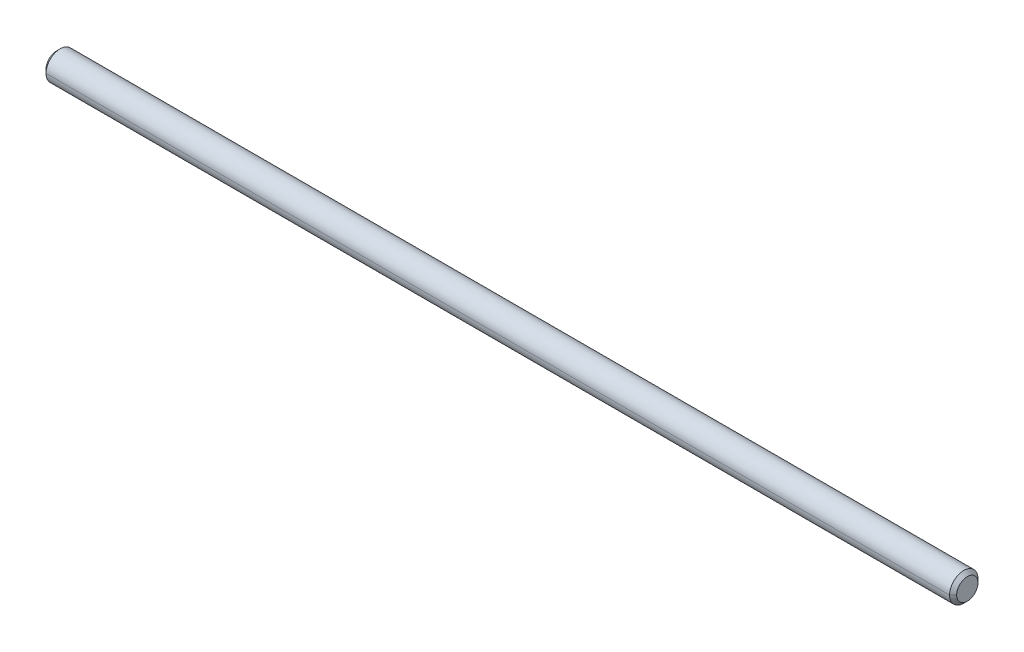
ISO-10303-21;
HEADER;
FILE_DESCRIPTION(('STEP AP214'),'2;1');
FILE_NAME('part.step','',(''),(''),'','','');
FILE_SCHEMA(('AUTOMOTIVE_DESIGN { 1 0 10303 214 1 1 1 1 }'));
ENDSEC;
DATA;
#1=APPLICATION_CONTEXT('core data for automotive mechanical design processes');
#2=APPLICATION_PROTOCOL_DEFINITION('international standard','automotive_design',2000,#1);
#3=PRODUCT_CONTEXT('',#1,'mechanical');
#4=PRODUCT('Part','Part','',(#3));
#5=PRODUCT_RELATED_PRODUCT_CATEGORY('part','',(#4));
#6=PRODUCT_DEFINITION_FORMATION('','',#4);
#7=PRODUCT_DEFINITION_CONTEXT('part definition',#1,'design');
#8=PRODUCT_DEFINITION('design','',#6,#7);
#9=PRODUCT_DEFINITION_SHAPE('','',#8);
#10=(LENGTH_UNIT() NAMED_UNIT(*) SI_UNIT(.MILLI.,.METRE.));
#11=(NAMED_UNIT(*) PLANE_ANGLE_UNIT() SI_UNIT($,.RADIAN.));
#12=(NAMED_UNIT(*) SI_UNIT($,.STERADIAN.) SOLID_ANGLE_UNIT());
#13=UNCERTAINTY_MEASURE_WITH_UNIT(LENGTH_MEASURE(1.E-05),#10,'distance_accuracy_value','');
#14=(GEOMETRIC_REPRESENTATION_CONTEXT(3) GLOBAL_UNCERTAINTY_ASSIGNED_CONTEXT((#13)) GLOBAL_UNIT_ASSIGNED_CONTEXT((#10,
#11,#12)) REPRESENTATION_CONTEXT('',''));
#15=CARTESIAN_POINT('',(0.,0.,0.));
#16=DIRECTION('',(0.,0.,1.));
#17=DIRECTION('',(1.,0.,0.));
#18=AXIS2_PLACEMENT_3D('',#15,#16,#17);
#19=CARTESIAN_POINT('',(152.4,0.,0.));
#20=DIRECTION('',(-1.,0.,0.));
#21=DIRECTION('',(0.,0.,1.));
#22=AXIS2_PLACEMENT_3D('',#19,#20,#21);
#23=CONICAL_SURFACE('',#22,3.571875,0.785398163397471);
#24=DIRECTION('',(-0.707106781186532,0.,-0.707106781186564));
#25=VECTOR('',#24,1.);
#26=CARTESIAN_POINT('',(152.4,0.,-3.571875));
#27=LINE('',#26,#25);
#28=CARTESIAN_POINT('',(152.4,0.,-3.571875));
#29=VERTEX_POINT('',#28);
#30=CARTESIAN_POINT('',(151.209375,0.,-4.7625));
#31=VERTEX_POINT('',#30);
#32=EDGE_CURVE('E77',#29,#31,#27,.T.);
#33=ORIENTED_EDGE('',*,*,#32,.F.);
#34=CARTESIAN_POINT('',(152.4,0.,0.));
#35=DIRECTION('',(1.,0.,0.));
#36=DIRECTION('',(0.,0.,-1.));
#37=AXIS2_PLACEMENT_3D('',#34,#35,#36);
#38=CIRCLE('',#37,3.571875);
#39=CARTESIAN_POINT('',(152.4,0.,3.571875));
#40=VERTEX_POINT('',#39);
#41=EDGE_CURVE('E11',#40,#29,#38,.T.);
#42=ORIENTED_EDGE('',*,*,#41,.F.);
#43=DIRECTION('',(-0.707106781186532,0.,0.707106781186564));
#44=VECTOR('',#43,1.);
#45=CARTESIAN_POINT('',(152.4,0.,3.571875));
#46=LINE('',#45,#44);
#47=CARTESIAN_POINT('',(151.209375,0.,4.7625));
#48=VERTEX_POINT('',#47);
#49=EDGE_CURVE('E74',#40,#48,#46,.T.);
#50=ORIENTED_EDGE('',*,*,#49,.T.);
#51=CARTESIAN_POINT('',(151.209375,0.,0.));
#52=DIRECTION('',(-1.,0.,0.));
#53=DIRECTION('',(0.,0.,-1.));
#54=AXIS2_PLACEMENT_3D('',#51,#52,#53);
#55=CIRCLE('',#54,4.7625);
#56=EDGE_CURVE('E117',#31,#48,#55,.T.);
#57=ORIENTED_EDGE('',*,*,#56,.F.);
#58=EDGE_LOOP('',(#33,#42,#50,#57));
#59=FACE_BOUND('',#58,.T.);
#60=ADVANCED_FACE('F17',(#59),#23,.T.);
#61=CARTESIAN_POINT('',(-151.209375,0.,0.));
#62=DIRECTION('',(1.,0.,0.));
#63=DIRECTION('',(0.,0.,-1.));
#64=AXIS2_PLACEMENT_3D('',#61,#62,#63);
#65=CONICAL_SURFACE('',#64,4.7625,0.785398163397459);
#66=DIRECTION('',(0.70710678118654,0.,0.707106781186555));
#67=VECTOR('',#66,1.);
#68=CARTESIAN_POINT('',(-151.209375,0.,4.7625));
#69=LINE('',#68,#67);
#70=CARTESIAN_POINT('',(-152.4,0.,3.57187499999984));
#71=VERTEX_POINT('',#70);
#72=CARTESIAN_POINT('',(-151.209375,0.,4.7625));
#73=VERTEX_POINT('',#72);
#74=EDGE_CURVE('E108',#71,#73,#69,.T.);
#75=ORIENTED_EDGE('',*,*,#74,.F.);
#76=CARTESIAN_POINT('',(-152.4,0.,0.));
#77=DIRECTION('',(-1.,0.,0.));
#78=DIRECTION('',(0.,0.,-1.));
#79=AXIS2_PLACEMENT_3D('',#76,#77,#78);
#80=CIRCLE('',#79,3.57187499999984);
#81=CARTESIAN_POINT('',(-152.4,0.,-3.57187499999984));
#82=VERTEX_POINT('',#81);
#83=EDGE_CURVE('E25',#82,#71,#80,.T.);
#84=ORIENTED_EDGE('',*,*,#83,.F.);
#85=DIRECTION('',(0.70710678118654,0.,-0.707106781186555));
#86=VECTOR('',#85,1.);
#87=CARTESIAN_POINT('',(-151.209375,0.,-4.7625));
#88=LINE('',#87,#86);
#89=CARTESIAN_POINT('',(-151.209375,0.,-4.7625));
#90=VERTEX_POINT('',#89);
#91=EDGE_CURVE('E105',#82,#90,#88,.T.);
#92=ORIENTED_EDGE('',*,*,#91,.T.);
#93=CARTESIAN_POINT('',(-151.209375,0.,0.));
#94=DIRECTION('',(1.,0.,0.));
#95=DIRECTION('',(0.,0.,-1.));
#96=AXIS2_PLACEMENT_3D('',#93,#94,#95);
#97=CIRCLE('',#96,4.7625);
#98=EDGE_CURVE('E36',#73,#90,#97,.T.);
#99=ORIENTED_EDGE('',*,*,#98,.F.);
#100=EDGE_LOOP('',(#75,#84,#92,#99));
#101=FACE_BOUND('',#100,.T.);
#102=ADVANCED_FACE('F135',(#101),#65,.T.);
#103=CARTESIAN_POINT('',(152.4,0.,0.));
#104=DIRECTION('',(1.,0.,0.));
#105=DIRECTION('',(0.,1.,0.));
#106=AXIS2_PLACEMENT_3D('',#103,#104,#105);
#107=PLANE('',#106);
#108=ORIENTED_EDGE('',*,*,#41,.T.);
#109=CARTESIAN_POINT('',(152.4,0.,0.));
#110=DIRECTION('',(1.,0.,0.));
#111=DIRECTION('',(0.,0.,-1.));
#112=AXIS2_PLACEMENT_3D('',#109,#110,#111);
#113=CIRCLE('',#112,3.571875);
#114=EDGE_CURVE('E81',#29,#40,#113,.T.);
#115=ORIENTED_EDGE('',*,*,#114,.T.);
#116=EDGE_LOOP('',(#108,#115));
#117=FACE_BOUND('',#116,.T.);
#118=ADVANCED_FACE('F89',(#117),#107,.T.);
#119=CARTESIAN_POINT('',(-152.4,0.,0.));
#120=DIRECTION('',(1.,0.,0.));
#121=DIRECTION('',(0.,1.,0.));
#122=AXIS2_PLACEMENT_3D('',#119,#120,#121);
#123=PLANE('',#122);
#124=ORIENTED_EDGE('',*,*,#83,.T.);
#125=CARTESIAN_POINT('',(-152.4,0.,0.));
#126=DIRECTION('',(-1.,0.,0.));
#127=DIRECTION('',(0.,0.,-1.));
#128=AXIS2_PLACEMENT_3D('',#125,#126,#127);
#129=CIRCLE('',#128,3.57187499999984);
#130=EDGE_CURVE('E86',#71,#82,#129,.T.);
#131=ORIENTED_EDGE('',*,*,#130,.T.);
#132=EDGE_LOOP('',(#124,#131));
#133=FACE_BOUND('',#132,.T.);
#134=ADVANCED_FACE('F127',(#133),#123,.F.);
#135=CARTESIAN_POINT('',(-152.4,0.,0.));
#136=DIRECTION('',(1.,0.,0.));
#137=DIRECTION('',(0.,0.,-1.));
#138=AXIS2_PLACEMENT_3D('',#135,#136,#137);
#139=CYLINDRICAL_SURFACE('',#138,4.7625);
#140=DIRECTION('',(1.,0.,0.));
#141=VECTOR('',#140,1.);
#142=CARTESIAN_POINT('',(-152.4,0.,4.7625));
#143=LINE('',#142,#141);
#144=EDGE_CURVE('E97',#73,#48,#143,.T.);
#145=ORIENTED_EDGE('',*,*,#144,.F.);
#146=ORIENTED_EDGE('',*,*,#98,.T.);
#147=DIRECTION('',(1.,0.,0.));
#148=VECTOR('',#147,1.);
#149=CARTESIAN_POINT('',(-152.4,0.,-4.7625));
#150=LINE('',#149,#148);
#151=EDGE_CURVE('E101',#90,#31,#150,.T.);
#152=ORIENTED_EDGE('',*,*,#151,.T.);
#153=ORIENTED_EDGE('',*,*,#56,.T.);
#154=EDGE_LOOP('',(#145,#146,#152,#153));
#155=FACE_BOUND('',#154,.T.);
#156=ADVANCED_FACE('F139',(#155),#139,.T.);
#157=CARTESIAN_POINT('',(-152.4,0.,0.));
#158=DIRECTION('',(1.,0.,0.));
#159=DIRECTION('',(0.,0.,-1.));
#160=AXIS2_PLACEMENT_3D('',#157,#158,#159);
#161=CYLINDRICAL_SURFACE('',#160,4.7625);
#162=CARTESIAN_POINT('',(-151.209375,0.,0.));
#163=DIRECTION('',(1.,0.,0.));
#164=DIRECTION('',(0.,0.,-1.));
#165=AXIS2_PLACEMENT_3D('',#162,#163,#164);
#166=CIRCLE('',#165,4.7625);
#167=EDGE_CURVE('E114',#90,#73,#166,.T.);
#168=ORIENTED_EDGE('',*,*,#167,.T.);
#169=ORIENTED_EDGE('',*,*,#144,.T.);
#170=CARTESIAN_POINT('',(151.209375,0.,0.));
#171=DIRECTION('',(-1.,0.,0.));
#172=DIRECTION('',(0.,0.,-1.));
#173=AXIS2_PLACEMENT_3D('',#170,#171,#172);
#174=CIRCLE('',#173,4.7625);
#175=EDGE_CURVE('E88',#48,#31,#174,.T.);
#176=ORIENTED_EDGE('',*,*,#175,.T.);
#177=ORIENTED_EDGE('',*,*,#151,.F.);
#178=EDGE_LOOP('',(#168,#169,#176,#177));
#179=FACE_BOUND('',#178,.T.);
#180=ADVANCED_FACE('F140',(#179),#161,.T.);
#181=CARTESIAN_POINT('',(-151.209375,0.,0.));
#182=DIRECTION('',(1.,0.,0.));
#183=DIRECTION('',(0.,0.,-1.));
#184=AXIS2_PLACEMENT_3D('',#181,#182,#183);
#185=CONICAL_SURFACE('',#184,4.7625,0.785398163397459);
#186=ORIENTED_EDGE('',*,*,#130,.F.);
#187=ORIENTED_EDGE('',*,*,#74,.T.);
#188=ORIENTED_EDGE('',*,*,#167,.F.);
#189=ORIENTED_EDGE('',*,*,#91,.F.);
#190=EDGE_LOOP('',(#186,#187,#188,#189));
#191=FACE_BOUND('',#190,.T.);
#192=ADVANCED_FACE('F134',(#191),#185,.T.);
#193=CARTESIAN_POINT('',(152.4,0.,0.));
#194=DIRECTION('',(-1.,0.,0.));
#195=DIRECTION('',(0.,0.,1.));
#196=AXIS2_PLACEMENT_3D('',#193,#194,#195);
#197=CONICAL_SURFACE('',#196,3.571875,0.785398163397471);
#198=ORIENTED_EDGE('',*,*,#114,.F.);
#199=ORIENTED_EDGE('',*,*,#32,.T.);
#200=ORIENTED_EDGE('',*,*,#175,.F.);
#201=ORIENTED_EDGE('',*,*,#49,.F.);
#202=EDGE_LOOP('',(#198,#199,#200,#201));
#203=FACE_BOUND('',#202,.T.);
#204=ADVANCED_FACE('F84',(#203),#197,.T.);
#205=CLOSED_SHELL('',(#60,#102,#118,#134,#156,#180,#192,#204));
#206=MANIFOLD_SOLID_BREP('B1',#205);
#207=ADVANCED_BREP_SHAPE_REPRESENTATION('',(#18,#206),#14);
#208=SHAPE_DEFINITION_REPRESENTATION(#9,#207);
ENDSEC;
END-ISO-10303-21;
